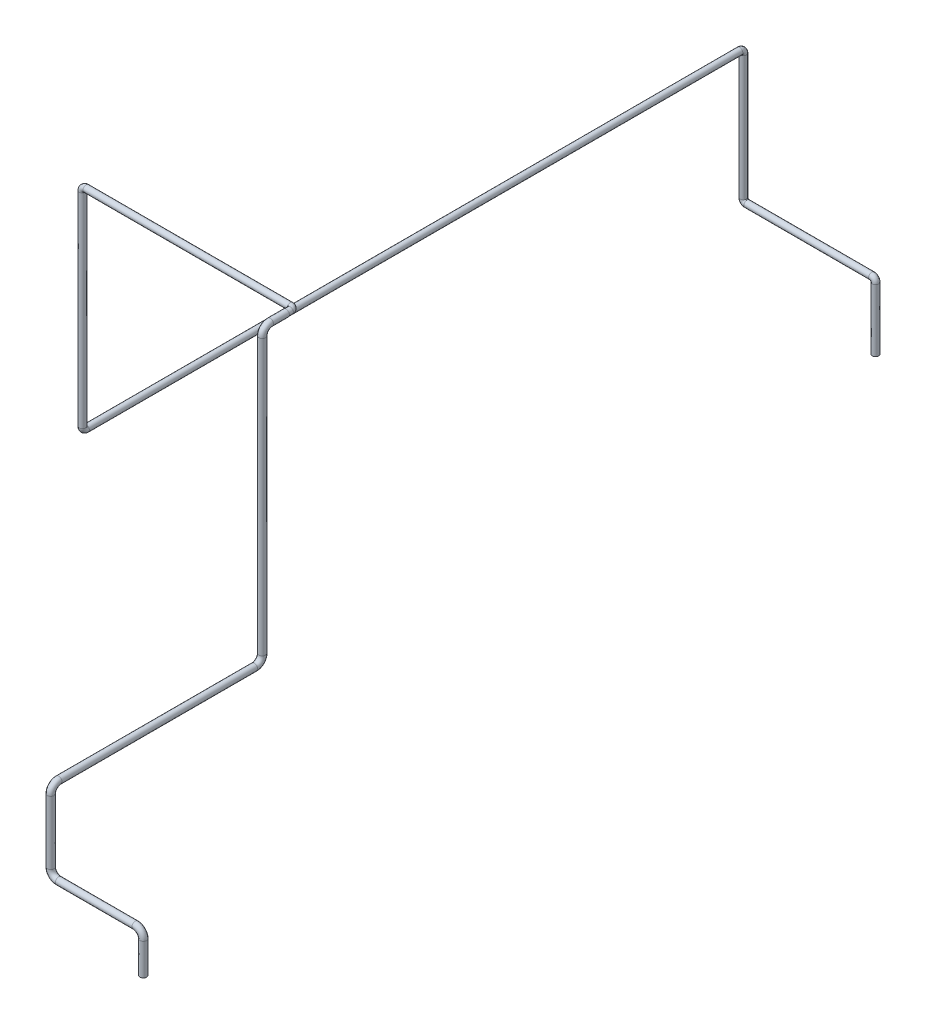
ISO-10303-21;
HEADER;
FILE_DESCRIPTION(('STEP AP214'),'2;1');
FILE_NAME('part.step','',(''),(''),'','','');
FILE_SCHEMA(('AUTOMOTIVE_DESIGN { 1 0 10303 214 1 1 1 1 }'));
ENDSEC;
DATA;
#1=APPLICATION_CONTEXT('core data for automotive mechanical design processes');
#2=APPLICATION_PROTOCOL_DEFINITION('international standard','automotive_design',2000,#1);
#3=PRODUCT_CONTEXT('',#1,'mechanical');
#4=PRODUCT('Part','Part','',(#3));
#5=PRODUCT_RELATED_PRODUCT_CATEGORY('part','',(#4));
#6=PRODUCT_DEFINITION_FORMATION('','',#4);
#7=PRODUCT_DEFINITION_CONTEXT('part definition',#1,'design');
#8=PRODUCT_DEFINITION('design','',#6,#7);
#9=PRODUCT_DEFINITION_SHAPE('','',#8);
#10=(LENGTH_UNIT() NAMED_UNIT(*) SI_UNIT(.MILLI.,.METRE.));
#11=(NAMED_UNIT(*) PLANE_ANGLE_UNIT() SI_UNIT($,.RADIAN.));
#12=(NAMED_UNIT(*) SI_UNIT($,.STERADIAN.) SOLID_ANGLE_UNIT());
#13=UNCERTAINTY_MEASURE_WITH_UNIT(LENGTH_MEASURE(1.E-05),#10,'distance_accuracy_value','');
#14=(GEOMETRIC_REPRESENTATION_CONTEXT(3) GLOBAL_UNCERTAINTY_ASSIGNED_CONTEXT((#13)) GLOBAL_UNIT_ASSIGNED_CONTEXT((#10,
#11,#12)) REPRESENTATION_CONTEXT('',''));
#15=CARTESIAN_POINT('',(0.,0.,0.));
#16=DIRECTION('',(0.,0.,1.));
#17=DIRECTION('',(1.,0.,0.));
#18=AXIS2_PLACEMENT_3D('',#15,#16,#17);
#19=CARTESIAN_POINT('',(0.,0.,20.));
#20=DIRECTION('',(0.,0.,-1.));
#21=DIRECTION('',(-1.,0.,0.));
#22=AXIS2_PLACEMENT_3D('',#19,#20,#21);
#23=CYLINDRICAL_SURFACE('',#22,12.7);
#24=CARTESIAN_POINT('',(0.,0.,0.));
#25=DIRECTION('',(0.,0.,1.));
#26=DIRECTION('',(1.,0.,0.));
#27=AXIS2_PLACEMENT_3D('',#24,#25,#26);
#28=CIRCLE('',#27,12.7);
#29=CARTESIAN_POINT('',(12.7,0.,0.));
#30=VERTEX_POINT('',#29);
#31=EDGE_CURVE('E11',#30,#30,#28,.T.);
#32=ORIENTED_EDGE('',*,*,#31,.T.);
#33=EDGE_LOOP('',(#32));
#34=FACE_BOUND('',#33,.T.);
#35=CARTESIAN_POINT('',(0.,0.,60.));
#36=DIRECTION('',(0.,0.,1.));
#37=DIRECTION('',(1.,0.,0.));
#38=AXIS2_PLACEMENT_3D('',#35,#36,#37);
#39=CIRCLE('',#38,12.7);
#40=CARTESIAN_POINT('',(0.,12.7,60.));
#41=VERTEX_POINT('',#40);
#42=EDGE_CURVE('E53',#41,#41,#39,.T.);
#43=ORIENTED_EDGE('',*,*,#42,.F.);
#44=EDGE_LOOP('',(#43));
#45=FACE_BOUND('',#44,.T.);
#46=ADVANCED_FACE('F35',(#34,#45),#23,.T.);
#47=CARTESIAN_POINT('',(0.,0.,0.));
#48=DIRECTION('',(0.,0.,1.));
#49=DIRECTION('',(1.,0.,0.));
#50=AXIS2_PLACEMENT_3D('',#47,#48,#49);
#51=PLANE('',#50);
#52=CARTESIAN_POINT('',(0.,0.,0.));
#53=DIRECTION('',(0.,0.,-1.));
#54=DIRECTION('',(-1.,0.,0.));
#55=AXIS2_PLACEMENT_3D('',#52,#53,#54);
#56=CIRCLE('',#55,12.);
#57=CARTESIAN_POINT('',(-12.,0.,0.));
#58=VERTEX_POINT('',#57);
#59=EDGE_CURVE('E227',#58,#58,#56,.T.);
#60=ORIENTED_EDGE('',*,*,#59,.F.);
#61=EDGE_LOOP('',(#60));
#62=FACE_BOUND('',#61,.T.);
#63=ORIENTED_EDGE('',*,*,#31,.F.);
#64=EDGE_LOOP('',(#63));
#65=FACE_BOUND('',#64,.T.);
#66=ADVANCED_FACE('F149',(#62,#65),#51,.F.);
#67=CARTESIAN_POINT('',(350.,-1550.,890.));
#68=DIRECTION('',(0.,-1.,0.));
#69=DIRECTION('',(1.,0.,0.));
#70=AXIS2_PLACEMENT_3D('',#67,#68,#69);
#71=PLANE('',#70);
#72=CARTESIAN_POINT('',(350.,-1550.,890.));
#73=DIRECTION('',(0.,-1.,0.));
#74=DIRECTION('',(1.,0.,0.));
#75=AXIS2_PLACEMENT_3D('',#72,#73,#74);
#76=CIRCLE('',#75,12.7);
#77=CARTESIAN_POINT('',(362.7,-1550.,890.));
#78=VERTEX_POINT('',#77);
#79=EDGE_CURVE('E42',#78,#78,#76,.T.);
#80=ORIENTED_EDGE('',*,*,#79,.T.);
#81=EDGE_LOOP('',(#80));
#82=FACE_BOUND('',#81,.T.);
#83=ADVANCED_FACE('F144',(#82),#71,.T.);
#84=CARTESIAN_POINT('',(0.,-30.,60.));
#85=DIRECTION('',(1.,0.,0.));
#86=DIRECTION('',(0.,0.,-1.));
#87=AXIS2_PLACEMENT_3D('',#84,#85,#86);
#88=TOROIDAL_SURFACE('',#87,30.,12.7);
#89=CARTESIAN_POINT('',(0.,-30.,90.));
#90=DIRECTION('',(0.,-1.,0.));
#91=DIRECTION('',(1.,0.,0.));
#92=AXIS2_PLACEMENT_3D('',#89,#90,#91);
#93=CIRCLE('',#92,12.7);
#94=CARTESIAN_POINT('',(0.,-30.,102.7));
#95=VERTEX_POINT('',#94);
#96=EDGE_CURVE('E57',#95,#95,#93,.T.);
#97=CARTESIAN_POINT('',(0.,-30.,60.));
#98=DIRECTION('',(1.,0.,0.));
#99=DIRECTION('',(0.,0.,-1.));
#100=AXIS2_PLACEMENT_3D('',#97,#98,#99);
#101=CIRCLE('',#100,42.7);
#102=EDGE_CURVE('',#41,#95,#101,.T.);
#103=ORIENTED_EDGE('',*,*,#42,.T.);
#104=ORIENTED_EDGE('',*,*,#96,.F.);
#105=ORIENTED_EDGE('',*,*,#102,.T.);
#106=ORIENTED_EDGE('',*,*,#102,.F.);
#107=EDGE_LOOP('',(#103,#105,#104,#106));
#108=FACE_BOUND('',#107,.T.);
#109=ADVANCED_FACE('F138',(#108),#88,.T.);
#110=CARTESIAN_POINT('',(0.,-30.,90.));
#111=DIRECTION('',(0.,-1.,0.));
#112=DIRECTION('',(0.,0.,-1.));
#113=AXIS2_PLACEMENT_3D('',#110,#111,#112);
#114=CYLINDRICAL_SURFACE('',#113,12.7);
#115=CARTESIAN_POINT('',(0.,-1070.,90.));
#116=DIRECTION('',(0.,-1.,0.));
#117=DIRECTION('',(1.,0.,0.));
#118=AXIS2_PLACEMENT_3D('',#115,#116,#117);
#119=CIRCLE('',#118,12.7);
#120=CARTESIAN_POINT('',(0.,-1070.,77.3));
#121=VERTEX_POINT('',#120);
#122=EDGE_CURVE('E66',#121,#121,#119,.T.);
#123=ORIENTED_EDGE('',*,*,#122,.F.);
#124=EDGE_LOOP('',(#123));
#125=FACE_BOUND('',#124,.T.);
#126=ORIENTED_EDGE('',*,*,#96,.T.);
#127=EDGE_LOOP('',(#126));
#128=FACE_BOUND('',#127,.T.);
#129=ADVANCED_FACE('F132',(#125,#128),#114,.T.);
#130=CARTESIAN_POINT('',(0.,-1070.,120.));
#131=DIRECTION('',(-1.,0.,0.));
#132=DIRECTION('',(0.,0.,1.));
#133=AXIS2_PLACEMENT_3D('',#130,#131,#132);
#134=TOROIDAL_SURFACE('',#133,30.,12.7);
#135=CARTESIAN_POINT('',(0.,-1100.,120.));
#136=DIRECTION('',(0.,0.,1.));
#137=DIRECTION('',(1.,0.,0.));
#138=AXIS2_PLACEMENT_3D('',#135,#136,#137);
#139=CIRCLE('',#138,12.7);
#140=CARTESIAN_POINT('',(0.,-1112.7,120.));
#141=VERTEX_POINT('',#140);
#142=EDGE_CURVE('E69',#141,#141,#139,.T.);
#143=CARTESIAN_POINT('',(0.,-1070.,120.));
#144=DIRECTION('',(-1.,0.,0.));
#145=DIRECTION('',(0.,0.,1.));
#146=AXIS2_PLACEMENT_3D('',#143,#144,#145);
#147=CIRCLE('',#146,42.7);
#148=EDGE_CURVE('',#121,#141,#147,.T.);
#149=ORIENTED_EDGE('',*,*,#122,.T.);
#150=ORIENTED_EDGE('',*,*,#142,.F.);
#151=ORIENTED_EDGE('',*,*,#148,.T.);
#152=ORIENTED_EDGE('',*,*,#148,.F.);
#153=EDGE_LOOP('',(#149,#151,#150,#152));
#154=FACE_BOUND('',#153,.T.);
#155=ADVANCED_FACE('F126',(#154),#134,.T.);
#156=CARTESIAN_POINT('',(0.,-1100.,120.));
#157=DIRECTION('',(0.,0.,1.));
#158=DIRECTION('',(1.,0.,0.));
#159=AXIS2_PLACEMENT_3D('',#156,#157,#158);
#160=CYLINDRICAL_SURFACE('',#159,12.7);
#161=CARTESIAN_POINT('',(0.,-1100.,860.));
#162=DIRECTION('',(0.,0.,1.));
#163=DIRECTION('',(1.,0.,0.));
#164=AXIS2_PLACEMENT_3D('',#161,#162,#163);
#165=CIRCLE('',#164,12.7);
#166=CARTESIAN_POINT('',(0.,-1087.3,860.));
#167=VERTEX_POINT('',#166);
#168=EDGE_CURVE('E72',#167,#167,#165,.T.);
#169=ORIENTED_EDGE('',*,*,#168,.F.);
#170=EDGE_LOOP('',(#169));
#171=FACE_BOUND('',#170,.T.);
#172=ORIENTED_EDGE('',*,*,#142,.T.);
#173=EDGE_LOOP('',(#172));
#174=FACE_BOUND('',#173,.T.);
#175=ADVANCED_FACE('F120',(#171,#174),#160,.T.);
#176=CARTESIAN_POINT('',(0.,-1130.,860.));
#177=DIRECTION('',(1.,0.,0.));
#178=DIRECTION('',(0.,0.,-1.));
#179=AXIS2_PLACEMENT_3D('',#176,#177,#178);
#180=TOROIDAL_SURFACE('',#179,30.,12.7);
#181=CARTESIAN_POINT('',(0.,-1130.,890.));
#182=DIRECTION('',(0.,-1.,0.));
#183=DIRECTION('',(1.,0.,0.));
#184=AXIS2_PLACEMENT_3D('',#181,#182,#183);
#185=CIRCLE('',#184,12.7);
#186=CARTESIAN_POINT('',(0.,-1130.,902.7));
#187=VERTEX_POINT('',#186);
#188=EDGE_CURVE('E75',#187,#187,#185,.T.);
#189=CARTESIAN_POINT('',(0.,-1130.,860.));
#190=DIRECTION('',(1.,0.,0.));
#191=DIRECTION('',(0.,0.,-1.));
#192=AXIS2_PLACEMENT_3D('',#189,#190,#191);
#193=CIRCLE('',#192,42.7);
#194=EDGE_CURVE('',#167,#187,#193,.T.);
#195=ORIENTED_EDGE('',*,*,#168,.T.);
#196=ORIENTED_EDGE('',*,*,#188,.F.);
#197=ORIENTED_EDGE('',*,*,#194,.T.);
#198=ORIENTED_EDGE('',*,*,#194,.F.);
#199=EDGE_LOOP('',(#195,#197,#196,#198));
#200=FACE_BOUND('',#199,.T.);
#201=ADVANCED_FACE('F114',(#200),#180,.T.);
#202=CARTESIAN_POINT('',(0.,-1130.,890.));
#203=DIRECTION('',(0.,-1.,0.));
#204=DIRECTION('',(0.,0.,-1.));
#205=AXIS2_PLACEMENT_3D('',#202,#203,#204);
#206=CYLINDRICAL_SURFACE('',#205,12.7);
#207=CARTESIAN_POINT('',(0.,-1370.,890.));
#208=DIRECTION('',(0.,-1.,0.));
#209=DIRECTION('',(1.,0.,0.));
#210=AXIS2_PLACEMENT_3D('',#207,#208,#209);
#211=CIRCLE('',#210,12.7);
#212=CARTESIAN_POINT('',(-12.7,-1370.,890.));
#213=VERTEX_POINT('',#212);
#214=EDGE_CURVE('E78',#213,#213,#211,.T.);
#215=ORIENTED_EDGE('',*,*,#214,.F.);
#216=EDGE_LOOP('',(#215));
#217=FACE_BOUND('',#216,.T.);
#218=ORIENTED_EDGE('',*,*,#188,.T.);
#219=EDGE_LOOP('',(#218));
#220=FACE_BOUND('',#219,.T.);
#221=ADVANCED_FACE('F108',(#217,#220),#206,.T.);
#222=CARTESIAN_POINT('',(30.,-1370.,890.));
#223=DIRECTION('',(0.,0.,1.));
#224=DIRECTION('',(1.,0.,0.));
#225=AXIS2_PLACEMENT_3D('',#222,#223,#224);
#226=TOROIDAL_SURFACE('',#225,30.,12.7);
#227=CARTESIAN_POINT('',(30.,-1400.,890.));
#228=DIRECTION('',(1.,0.,0.));
#229=DIRECTION('',(0.,1.,0.));
#230=AXIS2_PLACEMENT_3D('',#227,#228,#229);
#231=CIRCLE('',#230,12.7);
#232=CARTESIAN_POINT('',(30.,-1412.7,890.));
#233=VERTEX_POINT('',#232);
#234=EDGE_CURVE('E81',#233,#233,#231,.T.);
#235=CARTESIAN_POINT('',(30.,-1370.,890.));
#236=DIRECTION('',(0.,0.,1.));
#237=DIRECTION('',(1.,0.,0.));
#238=AXIS2_PLACEMENT_3D('',#235,#236,#237);
#239=CIRCLE('',#238,42.7);
#240=EDGE_CURVE('',#213,#233,#239,.T.);
#241=ORIENTED_EDGE('',*,*,#214,.T.);
#242=ORIENTED_EDGE('',*,*,#234,.F.);
#243=ORIENTED_EDGE('',*,*,#240,.T.);
#244=ORIENTED_EDGE('',*,*,#240,.F.);
#245=EDGE_LOOP('',(#241,#243,#242,#244));
#246=FACE_BOUND('',#245,.T.);
#247=ADVANCED_FACE('F102',(#246),#226,.T.);
#248=CARTESIAN_POINT('',(30.,-1400.,890.));
#249=DIRECTION('',(1.,0.,0.));
#250=DIRECTION('',(0.,0.,-1.));
#251=AXIS2_PLACEMENT_3D('',#248,#249,#250);
#252=CYLINDRICAL_SURFACE('',#251,12.7);
#253=CARTESIAN_POINT('',(320.,-1400.,890.));
#254=DIRECTION('',(1.,0.,0.));
#255=DIRECTION('',(0.,1.,0.));
#256=AXIS2_PLACEMENT_3D('',#253,#254,#255);
#257=CIRCLE('',#256,12.7);
#258=CARTESIAN_POINT('',(320.,-1387.3,890.));
#259=VERTEX_POINT('',#258);
#260=EDGE_CURVE('E84',#259,#259,#257,.T.);
#261=ORIENTED_EDGE('',*,*,#260,.F.);
#262=EDGE_LOOP('',(#261));
#263=FACE_BOUND('',#262,.T.);
#264=ORIENTED_EDGE('',*,*,#234,.T.);
#265=EDGE_LOOP('',(#264));
#266=FACE_BOUND('',#265,.T.);
#267=ADVANCED_FACE('F96',(#263,#266),#252,.T.);
#268=CARTESIAN_POINT('',(320.,-1430.,890.));
#269=DIRECTION('',(0.,0.,-1.));
#270=DIRECTION('',(-1.,0.,0.));
#271=AXIS2_PLACEMENT_3D('',#268,#269,#270);
#272=TOROIDAL_SURFACE('',#271,30.,12.7);
#273=CARTESIAN_POINT('',(350.,-1430.,890.));
#274=DIRECTION('',(0.,-1.,0.));
#275=DIRECTION('',(1.,0.,0.));
#276=AXIS2_PLACEMENT_3D('',#273,#274,#275);
#277=CIRCLE('',#276,12.7);
#278=CARTESIAN_POINT('',(362.7,-1430.,890.));
#279=VERTEX_POINT('',#278);
#280=EDGE_CURVE('E87',#279,#279,#277,.T.);
#281=CARTESIAN_POINT('',(320.,-1430.,890.));
#282=DIRECTION('',(0.,0.,-1.));
#283=DIRECTION('',(-1.,0.,0.));
#284=AXIS2_PLACEMENT_3D('',#281,#282,#283);
#285=CIRCLE('',#284,42.7);
#286=EDGE_CURVE('',#259,#279,#285,.T.);
#287=ORIENTED_EDGE('',*,*,#260,.T.);
#288=ORIENTED_EDGE('',*,*,#280,.F.);
#289=ORIENTED_EDGE('',*,*,#286,.T.);
#290=ORIENTED_EDGE('',*,*,#286,.F.);
#291=EDGE_LOOP('',(#287,#289,#288,#290));
#292=FACE_BOUND('',#291,.T.);
#293=ADVANCED_FACE('F93',(#292),#272,.T.);
#294=CARTESIAN_POINT('',(350.,-1430.,890.));
#295=DIRECTION('',(0.,-1.,0.));
#296=DIRECTION('',(0.,0.,-1.));
#297=AXIS2_PLACEMENT_3D('',#294,#295,#296);
#298=CYLINDRICAL_SURFACE('',#297,12.7);
#299=ORIENTED_EDGE('',*,*,#79,.F.);
#300=EDGE_LOOP('',(#299));
#301=FACE_BOUND('',#300,.T.);
#302=ORIENTED_EDGE('',*,*,#280,.T.);
#303=EDGE_LOOP('',(#302));
#304=FACE_BOUND('',#303,.T.);
#305=ADVANCED_FACE('F91',(#301,#304),#298,.T.);
#306=CARTESIAN_POINT('',(-300.,-1550.,-2530.));
#307=DIRECTION('',(0.,-1.,0.));
#308=DIRECTION('',(0.,0.,1.));
#309=AXIS2_PLACEMENT_3D('',#306,#307,#308);
#310=PLANE('',#309);
#311=CARTESIAN_POINT('',(-300.,-1550.,-2530.));
#312=DIRECTION('',(0.,-1.,0.));
#313=DIRECTION('',(0.,0.,1.));
#314=AXIS2_PLACEMENT_3D('',#311,#312,#313);
#315=CIRCLE('',#314,12.);
#316=CARTESIAN_POINT('',(-300.,-1550.,-2518.));
#317=VERTEX_POINT('',#316);
#318=EDGE_CURVE('E50',#317,#317,#315,.T.);
#319=ORIENTED_EDGE('',*,*,#318,.T.);
#320=EDGE_LOOP('',(#319));
#321=FACE_BOUND('',#320,.T.);
#322=ADVANCED_FACE('F51',(#321),#310,.T.);
#323=CARTESIAN_POINT('',(0.,0.,0.));
#324=DIRECTION('',(0.,0.,-1.));
#325=DIRECTION('',(-1.,0.,0.));
#326=AXIS2_PLACEMENT_3D('',#323,#324,#325);
#327=CYLINDRICAL_SURFACE('',#326,12.);
#328=CARTESIAN_POINT('',(0.,0.,-16.));
#329=DIRECTION('',(0.,0.,-1.));
#330=DIRECTION('',(-1.,0.,0.));
#331=AXIS2_PLACEMENT_3D('',#328,#329,#330);
#332=CIRCLE('',#331,12.);
#333=CARTESIAN_POINT('',(12.,0.,-16.));
#334=VERTEX_POINT('',#333);
#335=EDGE_CURVE('E225',#334,#334,#332,.T.);
#336=ORIENTED_EDGE('',*,*,#335,.F.);
#337=EDGE_LOOP('',(#336));
#338=FACE_BOUND('',#337,.T.);
#339=ORIENTED_EDGE('',*,*,#59,.T.);
#340=EDGE_LOOP('',(#339));
#341=FACE_BOUND('',#340,.T.);
#342=ADVANCED_FACE('F169',(#338,#341),#327,.T.);
#343=CARTESIAN_POINT('',(-14.,0.,-16.));
#344=DIRECTION('',(0.,1.,0.));
#345=DIRECTION('',(0.,0.,1.));
#346=AXIS2_PLACEMENT_3D('',#343,#344,#345);
#347=TOROIDAL_SURFACE('',#346,14.,12.);
#348=CARTESIAN_POINT('',(-14.,0.,-30.));
#349=DIRECTION('',(-1.,0.,0.));
#350=DIRECTION('',(0.,0.,1.));
#351=AXIS2_PLACEMENT_3D('',#348,#349,#350);
#352=CIRCLE('',#351,12.);
#353=CARTESIAN_POINT('',(-14.,0.,-42.));
#354=VERTEX_POINT('',#353);
#355=EDGE_CURVE('E229',#354,#354,#352,.T.);
#356=CARTESIAN_POINT('',(-14.,0.,-16.));
#357=DIRECTION('',(0.,1.,0.));
#358=DIRECTION('',(0.,0.,1.));
#359=AXIS2_PLACEMENT_3D('',#356,#357,#358);
#360=CIRCLE('',#359,26.);
#361=EDGE_CURVE('',#334,#354,#360,.T.);
#362=ORIENTED_EDGE('',*,*,#335,.T.);
#363=ORIENTED_EDGE('',*,*,#355,.F.);
#364=ORIENTED_EDGE('',*,*,#361,.T.);
#365=ORIENTED_EDGE('',*,*,#361,.F.);
#366=EDGE_LOOP('',(#362,#364,#363,#365));
#367=FACE_BOUND('',#366,.T.);
#368=ADVANCED_FACE('F213',(#367),#347,.T.);
#369=CARTESIAN_POINT('',(-14.,0.,-30.));
#370=DIRECTION('',(-1.,0.,0.));
#371=DIRECTION('',(0.,0.,1.));
#372=AXIS2_PLACEMENT_3D('',#369,#370,#371);
#373=CYLINDRICAL_SURFACE('',#372,12.);
#374=CARTESIAN_POINT('',(-786.,0.,-30.));
#375=DIRECTION('',(-1.,0.,0.));
#376=DIRECTION('',(0.,0.,1.));
#377=AXIS2_PLACEMENT_3D('',#374,#375,#376);
#378=CIRCLE('',#377,12.);
#379=CARTESIAN_POINT('',(-786.,12.,-30.));
#380=VERTEX_POINT('',#379);
#381=EDGE_CURVE('E234',#380,#380,#378,.T.);
#382=ORIENTED_EDGE('',*,*,#381,.F.);
#383=EDGE_LOOP('',(#382));
#384=FACE_BOUND('',#383,.T.);
#385=ORIENTED_EDGE('',*,*,#355,.T.);
#386=EDGE_LOOP('',(#385));
#387=FACE_BOUND('',#386,.T.);
#388=ADVANCED_FACE('F209',(#384,#387),#373,.T.);
#389=CARTESIAN_POINT('',(-786.,-14.,-30.));
#390=DIRECTION('',(0.,0.,1.));
#391=DIRECTION('',(1.,0.,0.));
#392=AXIS2_PLACEMENT_3D('',#389,#390,#391);
#393=TOROIDAL_SURFACE('',#392,14.,12.);
#394=CARTESIAN_POINT('',(-800.,-14.,-30.));
#395=DIRECTION('',(0.,-1.,0.));
#396=DIRECTION('',(0.,0.,1.));
#397=AXIS2_PLACEMENT_3D('',#394,#395,#396);
#398=CIRCLE('',#397,12.);
#399=CARTESIAN_POINT('',(-812.,-14.,-30.));
#400=VERTEX_POINT('',#399);
#401=EDGE_CURVE('E237',#400,#400,#398,.T.);
#402=CARTESIAN_POINT('',(-786.,-14.,-30.));
#403=DIRECTION('',(0.,0.,1.));
#404=DIRECTION('',(1.,0.,0.));
#405=AXIS2_PLACEMENT_3D('',#402,#403,#404);
#406=CIRCLE('',#405,26.);
#407=EDGE_CURVE('',#380,#400,#406,.T.);
#408=ORIENTED_EDGE('',*,*,#381,.T.);
#409=ORIENTED_EDGE('',*,*,#401,.F.);
#410=ORIENTED_EDGE('',*,*,#407,.T.);
#411=ORIENTED_EDGE('',*,*,#407,.F.);
#412=EDGE_LOOP('',(#408,#410,#409,#411));
#413=FACE_BOUND('',#412,.T.);
#414=ADVANCED_FACE('F205',(#413),#393,.T.);
#415=CARTESIAN_POINT('',(-800.,-14.,-30.));
#416=DIRECTION('',(0.,-1.,0.));
#417=DIRECTION('',(0.,0.,-1.));
#418=AXIS2_PLACEMENT_3D('',#415,#416,#417);
#419=CYLINDRICAL_SURFACE('',#418,12.);
#420=CARTESIAN_POINT('',(-800.,-786.,-30.));
#421=DIRECTION('',(0.,-1.,0.));
#422=DIRECTION('',(0.,0.,1.));
#423=AXIS2_PLACEMENT_3D('',#420,#421,#422);
#424=CIRCLE('',#423,12.);
#425=CARTESIAN_POINT('',(-800.,-786.,-18.));
#426=VERTEX_POINT('',#425);
#427=EDGE_CURVE('E240',#426,#426,#424,.T.);
#428=ORIENTED_EDGE('',*,*,#427,.F.);
#429=EDGE_LOOP('',(#428));
#430=FACE_BOUND('',#429,.T.);
#431=ORIENTED_EDGE('',*,*,#401,.T.);
#432=EDGE_LOOP('',(#431));
#433=FACE_BOUND('',#432,.T.);
#434=ADVANCED_FACE('F201',(#430,#433),#419,.T.);
#435=CARTESIAN_POINT('',(-800.,-786.,-44.));
#436=DIRECTION('',(1.,0.,0.));
#437=DIRECTION('',(0.,0.,-1.));
#438=AXIS2_PLACEMENT_3D('',#435,#436,#437);
#439=TOROIDAL_SURFACE('',#438,14.,12.);
#440=CARTESIAN_POINT('',(-800.,-800.,-44.));
#441=DIRECTION('',(0.,0.,-1.));
#442=DIRECTION('',(0.,-1.,0.));
#443=AXIS2_PLACEMENT_3D('',#440,#441,#442);
#444=CIRCLE('',#443,12.);
#445=CARTESIAN_POINT('',(-800.,-812.,-44.));
#446=VERTEX_POINT('',#445);
#447=EDGE_CURVE('E243',#446,#446,#444,.T.);
#448=CARTESIAN_POINT('',(-800.,-786.,-44.));
#449=DIRECTION('',(1.,0.,0.));
#450=DIRECTION('',(0.,0.,-1.));
#451=AXIS2_PLACEMENT_3D('',#448,#449,#450);
#452=CIRCLE('',#451,26.);
#453=EDGE_CURVE('',#426,#446,#452,.T.);
#454=ORIENTED_EDGE('',*,*,#427,.T.);
#455=ORIENTED_EDGE('',*,*,#447,.F.);
#456=ORIENTED_EDGE('',*,*,#453,.T.);
#457=ORIENTED_EDGE('',*,*,#453,.F.);
#458=EDGE_LOOP('',(#454,#456,#455,#457));
#459=FACE_BOUND('',#458,.T.);
#460=ADVANCED_FACE('F197',(#459),#439,.T.);
#461=CARTESIAN_POINT('',(-800.,-800.,-44.));
#462=DIRECTION('',(0.,0.,-1.));
#463=DIRECTION('',(-1.,0.,0.));
#464=AXIS2_PLACEMENT_3D('',#461,#462,#463);
#465=CYLINDRICAL_SURFACE('',#464,12.);
#466=CARTESIAN_POINT('',(-800.,-800.,-2516.));
#467=DIRECTION('',(0.,0.,-1.));
#468=DIRECTION('',(0.,-1.,0.));
#469=AXIS2_PLACEMENT_3D('',#466,#467,#468);
#470=CIRCLE('',#469,12.);
#471=CARTESIAN_POINT('',(-800.,-788.,-2516.));
#472=VERTEX_POINT('',#471);
#473=EDGE_CURVE('E246',#472,#472,#470,.T.);
#474=ORIENTED_EDGE('',*,*,#473,.F.);
#475=EDGE_LOOP('',(#474));
#476=FACE_BOUND('',#475,.T.);
#477=ORIENTED_EDGE('',*,*,#447,.T.);
#478=EDGE_LOOP('',(#477));
#479=FACE_BOUND('',#478,.T.);
#480=ADVANCED_FACE('F193',(#476,#479),#465,.T.);
#481=CARTESIAN_POINT('',(-800.,-814.,-2516.));
#482=DIRECTION('',(-1.,0.,0.));
#483=DIRECTION('',(0.,0.,1.));
#484=AXIS2_PLACEMENT_3D('',#481,#482,#483);
#485=TOROIDAL_SURFACE('',#484,13.9999999999999,12.);
#486=CARTESIAN_POINT('',(-800.,-814.,-2530.));
#487=DIRECTION('',(0.,-1.,0.));
#488=DIRECTION('',(0.,0.,1.));
#489=AXIS2_PLACEMENT_3D('',#486,#487,#488);
#490=CIRCLE('',#489,12.);
#491=CARTESIAN_POINT('',(-800.,-814.,-2542.));
#492=VERTEX_POINT('',#491);
#493=EDGE_CURVE('E249',#492,#492,#490,.T.);
#494=CARTESIAN_POINT('',(-800.,-814.,-2516.));
#495=DIRECTION('',(-1.,0.,0.));
#496=DIRECTION('',(0.,0.,1.));
#497=AXIS2_PLACEMENT_3D('',#494,#495,#496);
#498=CIRCLE('',#497,25.9999999999999);
#499=EDGE_CURVE('',#472,#492,#498,.T.);
#500=ORIENTED_EDGE('',*,*,#473,.T.);
#501=ORIENTED_EDGE('',*,*,#493,.F.);
#502=ORIENTED_EDGE('',*,*,#499,.T.);
#503=ORIENTED_EDGE('',*,*,#499,.F.);
#504=EDGE_LOOP('',(#500,#502,#501,#503));
#505=FACE_BOUND('',#504,.T.);
#506=ADVANCED_FACE('F189',(#505),#485,.T.);
#507=CARTESIAN_POINT('',(-800.,-814.,-2530.));
#508=DIRECTION('',(0.,-1.,0.));
#509=DIRECTION('',(0.,0.,-1.));
#510=AXIS2_PLACEMENT_3D('',#507,#508,#509);
#511=CYLINDRICAL_SURFACE('',#510,12.);
#512=CARTESIAN_POINT('',(-800.,-1286.,-2530.));
#513=DIRECTION('',(0.,-1.,0.));
#514=DIRECTION('',(0.,0.,1.));
#515=AXIS2_PLACEMENT_3D('',#512,#513,#514);
#516=CIRCLE('',#515,12.);
#517=CARTESIAN_POINT('',(-812.,-1286.,-2530.));
#518=VERTEX_POINT('',#517);
#519=EDGE_CURVE('E252',#518,#518,#516,.T.);
#520=ORIENTED_EDGE('',*,*,#519,.F.);
#521=EDGE_LOOP('',(#520));
#522=FACE_BOUND('',#521,.T.);
#523=ORIENTED_EDGE('',*,*,#493,.T.);
#524=EDGE_LOOP('',(#523));
#525=FACE_BOUND('',#524,.T.);
#526=ADVANCED_FACE('F185',(#522,#525),#511,.T.);
#527=CARTESIAN_POINT('',(-786.,-1286.,-2530.));
#528=DIRECTION('',(0.,0.,1.));
#529=DIRECTION('',(1.,0.,0.));
#530=AXIS2_PLACEMENT_3D('',#527,#528,#529);
#531=TOROIDAL_SURFACE('',#530,14.,12.);
#532=CARTESIAN_POINT('',(-786.,-1300.,-2530.));
#533=DIRECTION('',(1.,0.,0.));
#534=DIRECTION('',(0.,0.,1.));
#535=AXIS2_PLACEMENT_3D('',#532,#533,#534);
#536=CIRCLE('',#535,12.);
#537=CARTESIAN_POINT('',(-786.,-1312.,-2530.));
#538=VERTEX_POINT('',#537);
#539=EDGE_CURVE('E255',#538,#538,#536,.T.);
#540=CARTESIAN_POINT('',(-786.,-1286.,-2530.));
#541=DIRECTION('',(0.,0.,1.));
#542=DIRECTION('',(1.,0.,0.));
#543=AXIS2_PLACEMENT_3D('',#540,#541,#542);
#544=CIRCLE('',#543,26.);
#545=EDGE_CURVE('',#518,#538,#544,.T.);
#546=ORIENTED_EDGE('',*,*,#519,.T.);
#547=ORIENTED_EDGE('',*,*,#539,.F.);
#548=ORIENTED_EDGE('',*,*,#545,.T.);
#549=ORIENTED_EDGE('',*,*,#545,.F.);
#550=EDGE_LOOP('',(#546,#548,#547,#549));
#551=FACE_BOUND('',#550,.T.);
#552=ADVANCED_FACE('F181',(#551),#531,.T.);
#553=CARTESIAN_POINT('',(-786.,-1300.,-2530.));
#554=DIRECTION('',(1.,0.,0.));
#555=DIRECTION('',(0.,0.,-1.));
#556=AXIS2_PLACEMENT_3D('',#553,#554,#555);
#557=CYLINDRICAL_SURFACE('',#556,12.);
#558=CARTESIAN_POINT('',(-314.,-1300.,-2530.));
#559=DIRECTION('',(1.,0.,0.));
#560=DIRECTION('',(0.,0.,1.));
#561=AXIS2_PLACEMENT_3D('',#558,#559,#560);
#562=CIRCLE('',#561,12.);
#563=CARTESIAN_POINT('',(-314.,-1288.,-2530.));
#564=VERTEX_POINT('',#563);
#565=EDGE_CURVE('E60',#564,#564,#562,.T.);
#566=ORIENTED_EDGE('',*,*,#565,.F.);
#567=EDGE_LOOP('',(#566));
#568=FACE_BOUND('',#567,.T.);
#569=ORIENTED_EDGE('',*,*,#539,.T.);
#570=EDGE_LOOP('',(#569));
#571=FACE_BOUND('',#570,.T.);
#572=ADVANCED_FACE('F177',(#568,#571),#557,.T.);
#573=CARTESIAN_POINT('',(-314.,-1314.,-2530.));
#574=DIRECTION('',(0.,0.,-1.));
#575=DIRECTION('',(-1.,0.,0.));
#576=AXIS2_PLACEMENT_3D('',#573,#574,#575);
#577=TOROIDAL_SURFACE('',#576,14.,12.);
#578=CARTESIAN_POINT('',(-300.,-1314.,-2530.));
#579=DIRECTION('',(0.,-1.,0.));
#580=DIRECTION('',(0.,0.,1.));
#581=AXIS2_PLACEMENT_3D('',#578,#579,#580);
#582=CIRCLE('',#581,12.);
#583=CARTESIAN_POINT('',(-288.,-1314.,-2530.));
#584=VERTEX_POINT('',#583);
#585=EDGE_CURVE('E54',#584,#584,#582,.T.);
#586=CARTESIAN_POINT('',(-314.,-1314.,-2530.));
#587=DIRECTION('',(0.,0.,-1.));
#588=DIRECTION('',(-1.,0.,0.));
#589=AXIS2_PLACEMENT_3D('',#586,#587,#588);
#590=CIRCLE('',#589,26.);
#591=EDGE_CURVE('',#564,#584,#590,.T.);
#592=ORIENTED_EDGE('',*,*,#565,.T.);
#593=ORIENTED_EDGE('',*,*,#585,.F.);
#594=ORIENTED_EDGE('',*,*,#591,.T.);
#595=ORIENTED_EDGE('',*,*,#591,.F.);
#596=EDGE_LOOP('',(#592,#594,#593,#595));
#597=FACE_BOUND('',#596,.T.);
#598=ADVANCED_FACE('F174',(#597),#577,.T.);
#599=CARTESIAN_POINT('',(-300.,-1314.,-2530.));
#600=DIRECTION('',(0.,-1.,0.));
#601=DIRECTION('',(0.,0.,-1.));
#602=AXIS2_PLACEMENT_3D('',#599,#600,#601);
#603=CYLINDRICAL_SURFACE('',#602,12.);
#604=ORIENTED_EDGE('',*,*,#318,.F.);
#605=EDGE_LOOP('',(#604));
#606=FACE_BOUND('',#605,.T.);
#607=ORIENTED_EDGE('',*,*,#585,.T.);
#608=EDGE_LOOP('',(#607));
#609=FACE_BOUND('',#608,.T.);
#610=ADVANCED_FACE('F161',(#606,#609),#603,.T.);
#611=CLOSED_SHELL('',(#46,#66,#83,#109,#129,#155,#175,#201,#221,#247,#267,#293,#305,#322,#342,
#368,#388,#414,#434,#460,#480,#506,#526,#552,#572,#598,#610));
#612=MANIFOLD_SOLID_BREP('B2',#611);
#613=ADVANCED_BREP_SHAPE_REPRESENTATION('',(#18,#612),#14);
#614=SHAPE_DEFINITION_REPRESENTATION(#9,#613);
ENDSEC;
END-ISO-10303-21;
